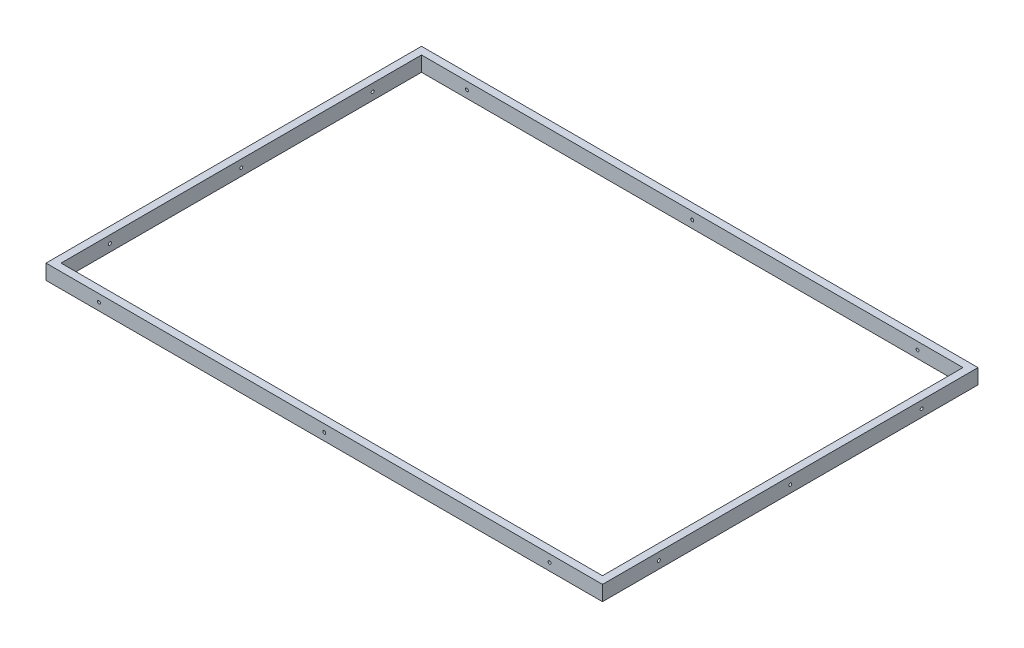
ISO-10303-21;
HEADER;
FILE_DESCRIPTION(('STEP AP214'),'2;1');
FILE_NAME('part.step','',(''),(''),'','','');
FILE_SCHEMA(('AUTOMOTIVE_DESIGN { 1 0 10303 214 1 1 1 1 }'));
ENDSEC;
DATA;
#1=APPLICATION_CONTEXT('core data for automotive mechanical design processes');
#2=APPLICATION_PROTOCOL_DEFINITION('international standard','automotive_design',2000,#1);
#3=PRODUCT_CONTEXT('',#1,'mechanical');
#4=PRODUCT('Part','Part','',(#3));
#5=PRODUCT_RELATED_PRODUCT_CATEGORY('part','',(#4));
#6=PRODUCT_DEFINITION_FORMATION('','',#4);
#7=PRODUCT_DEFINITION_CONTEXT('part definition',#1,'design');
#8=PRODUCT_DEFINITION('design','',#6,#7);
#9=PRODUCT_DEFINITION_SHAPE('','',#8);
#10=(LENGTH_UNIT() NAMED_UNIT(*) SI_UNIT(.MILLI.,.METRE.));
#11=(NAMED_UNIT(*) PLANE_ANGLE_UNIT() SI_UNIT($,.RADIAN.));
#12=(NAMED_UNIT(*) SI_UNIT($,.STERADIAN.) SOLID_ANGLE_UNIT());
#13=UNCERTAINTY_MEASURE_WITH_UNIT(LENGTH_MEASURE(1.E-05),#10,'distance_accuracy_value','');
#14=(GEOMETRIC_REPRESENTATION_CONTEXT(3) GLOBAL_UNCERTAINTY_ASSIGNED_CONTEXT((#13)) GLOBAL_UNIT_ASSIGNED_CONTEXT((#10,
#11,#12)) REPRESENTATION_CONTEXT('',''));
#15=CARTESIAN_POINT('',(0.,0.,0.));
#16=DIRECTION('',(0.,0.,1.));
#17=DIRECTION('',(1.,0.,0.));
#18=AXIS2_PLACEMENT_3D('',#15,#16,#17);
#19=CARTESIAN_POINT('',(0.,4.,0.));
#20=DIRECTION('',(0.,-1.,0.));
#21=DIRECTION('',(0.,0.,-1.));
#22=AXIS2_PLACEMENT_3D('',#19,#20,#21);
#23=PLANE('',#22);
#24=DIRECTION('',(0.,0.,-1.));
#25=VECTOR('',#24,1.);
#26=CARTESIAN_POINT('',(74.1,4.,50.));
#27=LINE('',#26,#25);
#28=CARTESIAN_POINT('',(74.1,4.,50.));
#29=VERTEX_POINT('',#28);
#30=CARTESIAN_POINT('',(74.1,4.,-50.));
#31=VERTEX_POINT('',#30);
#32=EDGE_CURVE('E144',#29,#31,#27,.T.);
#33=ORIENTED_EDGE('',*,*,#32,.T.);
#34=DIRECTION('',(-1.,0.,0.));
#35=VECTOR('',#34,1.);
#36=CARTESIAN_POINT('',(-74.1,4.,-50.));
#37=LINE('',#36,#35);
#38=CARTESIAN_POINT('',(-74.1,4.,-50.));
#39=VERTEX_POINT('',#38);
#40=EDGE_CURVE('E147',#31,#39,#37,.T.);
#41=ORIENTED_EDGE('',*,*,#40,.T.);
#42=DIRECTION('',(0.,0.,1.));
#43=VECTOR('',#42,1.);
#44=CARTESIAN_POINT('',(-74.1,4.,50.));
#45=LINE('',#44,#43);
#46=CARTESIAN_POINT('',(-74.1,4.,50.));
#47=VERTEX_POINT('',#46);
#48=EDGE_CURVE('E150',#39,#47,#45,.T.);
#49=ORIENTED_EDGE('',*,*,#48,.T.);
#50=DIRECTION('',(1.,0.,0.));
#51=VECTOR('',#50,1.);
#52=CARTESIAN_POINT('',(-74.1,4.,50.));
#53=LINE('',#52,#51);
#54=EDGE_CURVE('E152',#47,#29,#53,.T.);
#55=ORIENTED_EDGE('',*,*,#54,.T.);
#56=EDGE_LOOP('',(#33,#41,#49,#55));
#57=FACE_BOUND('',#56,.T.);
#58=DIRECTION('',(0.,0.,1.));
#59=VECTOR('',#58,1.);
#60=CARTESIAN_POINT('',(-72.1,4.,-48.));
#61=LINE('',#60,#59);
#62=CARTESIAN_POINT('',(-72.1,4.,-48.));
#63=VERTEX_POINT('',#62);
#64=CARTESIAN_POINT('',(-72.1,4.,48.));
#65=VERTEX_POINT('',#64);
#66=EDGE_CURVE('E106',#63,#65,#61,.T.);
#67=ORIENTED_EDGE('',*,*,#66,.F.);
#68=DIRECTION('',(-1.,0.,0.));
#69=VECTOR('',#68,1.);
#70=CARTESIAN_POINT('',(-72.1,4.,-48.));
#71=LINE('',#70,#69);
#72=CARTESIAN_POINT('',(72.1,4.,-48.));
#73=VERTEX_POINT('',#72);
#74=EDGE_CURVE('E128',#73,#63,#71,.T.);
#75=ORIENTED_EDGE('',*,*,#74,.F.);
#76=DIRECTION('',(0.,0.,-1.));
#77=VECTOR('',#76,1.);
#78=CARTESIAN_POINT('',(72.1,4.,-48.));
#79=LINE('',#78,#77);
#80=CARTESIAN_POINT('',(72.1,4.,48.));
#81=VERTEX_POINT('',#80);
#82=EDGE_CURVE('E126',#81,#73,#79,.T.);
#83=ORIENTED_EDGE('',*,*,#82,.F.);
#84=DIRECTION('',(1.,0.,0.));
#85=VECTOR('',#84,1.);
#86=CARTESIAN_POINT('',(-72.1,4.,48.));
#87=LINE('',#86,#85);
#88=EDGE_CURVE('E114',#65,#81,#87,.T.);
#89=ORIENTED_EDGE('',*,*,#88,.F.);
#90=EDGE_LOOP('',(#67,#75,#83,#89));
#91=FACE_BOUND('',#90,.T.);
#92=ADVANCED_FACE('F39',(#57,#91),#23,.F.);
#93=CARTESIAN_POINT('',(0.,0.,0.));
#94=DIRECTION('',(0.,-1.,0.));
#95=DIRECTION('',(0.,0.,-1.));
#96=AXIS2_PLACEMENT_3D('',#93,#94,#95);
#97=PLANE('',#96);
#98=DIRECTION('',(0.,0.,-1.));
#99=VECTOR('',#98,1.);
#100=CARTESIAN_POINT('',(74.1,0.,50.));
#101=LINE('',#100,#99);
#102=CARTESIAN_POINT('',(74.1,0.,50.));
#103=VERTEX_POINT('',#102);
#104=CARTESIAN_POINT('',(74.1,0.,-50.));
#105=VERTEX_POINT('',#104);
#106=EDGE_CURVE('E122',#103,#105,#101,.T.);
#107=ORIENTED_EDGE('',*,*,#106,.F.);
#108=DIRECTION('',(1.,0.,0.));
#109=VECTOR('',#108,1.);
#110=CARTESIAN_POINT('',(-74.1,0.,50.));
#111=LINE('',#110,#109);
#112=CARTESIAN_POINT('',(-74.1,0.,50.));
#113=VERTEX_POINT('',#112);
#114=EDGE_CURVE('E148',#113,#103,#111,.T.);
#115=ORIENTED_EDGE('',*,*,#114,.F.);
#116=DIRECTION('',(0.,0.,1.));
#117=VECTOR('',#116,1.);
#118=CARTESIAN_POINT('',(-74.1,0.,50.));
#119=LINE('',#118,#117);
#120=CARTESIAN_POINT('',(-74.1,0.,-50.));
#121=VERTEX_POINT('',#120);
#122=EDGE_CURVE('E159',#121,#113,#119,.T.);
#123=ORIENTED_EDGE('',*,*,#122,.F.);
#124=DIRECTION('',(-1.,0.,0.));
#125=VECTOR('',#124,1.);
#126=CARTESIAN_POINT('',(-74.1,0.,-50.));
#127=LINE('',#126,#125);
#128=EDGE_CURVE('E157',#105,#121,#127,.T.);
#129=ORIENTED_EDGE('',*,*,#128,.F.);
#130=EDGE_LOOP('',(#107,#115,#123,#129));
#131=FACE_BOUND('',#130,.T.);
#132=DIRECTION('',(-1.,0.,0.));
#133=VECTOR('',#132,1.);
#134=CARTESIAN_POINT('',(-72.1,0.,-48.));
#135=LINE('',#134,#133);
#136=CARTESIAN_POINT('',(72.1,0.,-48.));
#137=VERTEX_POINT('',#136);
#138=CARTESIAN_POINT('',(-72.1,0.,-48.));
#139=VERTEX_POINT('',#138);
#140=EDGE_CURVE('E115',#137,#139,#135,.T.);
#141=ORIENTED_EDGE('',*,*,#140,.T.);
#142=DIRECTION('',(0.,0.,1.));
#143=VECTOR('',#142,1.);
#144=CARTESIAN_POINT('',(-72.1,0.,-48.));
#145=LINE('',#144,#143);
#146=CARTESIAN_POINT('',(-72.1,0.,48.));
#147=VERTEX_POINT('',#146);
#148=EDGE_CURVE('E64',#139,#147,#145,.T.);
#149=ORIENTED_EDGE('',*,*,#148,.T.);
#150=DIRECTION('',(1.,0.,0.));
#151=VECTOR('',#150,1.);
#152=CARTESIAN_POINT('',(-72.1,0.,48.));
#153=LINE('',#152,#151);
#154=CARTESIAN_POINT('',(72.1,0.,48.));
#155=VERTEX_POINT('',#154);
#156=EDGE_CURVE('E121',#147,#155,#153,.T.);
#157=ORIENTED_EDGE('',*,*,#156,.T.);
#158=DIRECTION('',(0.,0.,-1.));
#159=VECTOR('',#158,1.);
#160=CARTESIAN_POINT('',(72.1,0.,-48.));
#161=LINE('',#160,#159);
#162=EDGE_CURVE('E136',#155,#137,#161,.T.);
#163=ORIENTED_EDGE('',*,*,#162,.T.);
#164=EDGE_LOOP('',(#141,#149,#157,#163));
#165=FACE_BOUND('',#164,.T.);
#166=ADVANCED_FACE('F262',(#131,#165),#97,.T.);
#167=CARTESIAN_POINT('',(74.1,4.,50.));
#168=DIRECTION('',(-1.,0.,0.));
#169=DIRECTION('',(0.,0.,1.));
#170=AXIS2_PLACEMENT_3D('',#167,#168,#169);
#171=PLANE('',#170);
#172=CARTESIAN_POINT('',(74.1,2.,-35.));
#173=DIRECTION('',(-1.,0.,0.));
#174=DIRECTION('',(0.,0.,1.));
#175=AXIS2_PLACEMENT_3D('',#172,#173,#174);
#176=CIRCLE('',#175,0.399999999999998);
#177=CARTESIAN_POINT('',(74.1,2.,-34.6));
#178=VERTEX_POINT('',#177);
#179=EDGE_CURVE('E342',#178,#178,#176,.T.);
#180=ORIENTED_EDGE('',*,*,#179,.T.);
#181=EDGE_LOOP('',(#180));
#182=FACE_BOUND('',#181,.T.);
#183=CARTESIAN_POINT('',(74.1,2.,35.));
#184=DIRECTION('',(-1.,0.,0.));
#185=DIRECTION('',(0.,0.,1.));
#186=AXIS2_PLACEMENT_3D('',#183,#184,#185);
#187=CIRCLE('',#186,0.399999999999998);
#188=CARTESIAN_POINT('',(74.1,2.,35.4));
#189=VERTEX_POINT('',#188);
#190=EDGE_CURVE('E333',#189,#189,#187,.T.);
#191=ORIENTED_EDGE('',*,*,#190,.T.);
#192=EDGE_LOOP('',(#191));
#193=FACE_BOUND('',#192,.T.);
#194=CARTESIAN_POINT('',(74.1,2.,0.));
#195=DIRECTION('',(-1.,0.,0.));
#196=DIRECTION('',(0.,0.,1.));
#197=AXIS2_PLACEMENT_3D('',#194,#195,#196);
#198=CIRCLE('',#197,0.4);
#199=CARTESIAN_POINT('',(74.1,2.,0.4));
#200=VERTEX_POINT('',#199);
#201=EDGE_CURVE('E184',#200,#200,#198,.T.);
#202=ORIENTED_EDGE('',*,*,#201,.T.);
#203=EDGE_LOOP('',(#202));
#204=FACE_BOUND('',#203,.T.);
#205=ORIENTED_EDGE('',*,*,#106,.T.);
#206=DIRECTION('',(0.,-1.,0.));
#207=VECTOR('',#206,1.);
#208=CARTESIAN_POINT('',(74.1,4.,-50.));
#209=LINE('',#208,#207);
#210=EDGE_CURVE('E11',#31,#105,#209,.T.);
#211=ORIENTED_EDGE('',*,*,#210,.F.);
#212=ORIENTED_EDGE('',*,*,#32,.F.);
#213=DIRECTION('',(0.,-1.,0.));
#214=VECTOR('',#213,1.);
#215=CARTESIAN_POINT('',(74.1,4.,50.));
#216=LINE('',#215,#214);
#217=EDGE_CURVE('E154',#29,#103,#216,.T.);
#218=ORIENTED_EDGE('',*,*,#217,.T.);
#219=EDGE_LOOP('',(#205,#211,#212,#218));
#220=FACE_BOUND('',#219,.T.);
#221=ADVANCED_FACE('F41',(#182,#193,#204,#220),#171,.F.);
#222=CARTESIAN_POINT('',(-74.1,4.,-50.));
#223=DIRECTION('',(0.,0.,1.));
#224=DIRECTION('',(1.,0.,0.));
#225=AXIS2_PLACEMENT_3D('',#222,#223,#224);
#226=PLANE('',#225);
#227=CARTESIAN_POINT('',(60.,2.,-50.));
#228=DIRECTION('',(0.,0.,1.));
#229=DIRECTION('',(1.,0.,0.));
#230=AXIS2_PLACEMENT_3D('',#227,#228,#229);
#231=CIRCLE('',#230,0.399999999999998);
#232=CARTESIAN_POINT('',(60.4,2.,-50.));
#233=VERTEX_POINT('',#232);
#234=EDGE_CURVE('E203',#233,#233,#231,.T.);
#235=ORIENTED_EDGE('',*,*,#234,.T.);
#236=EDGE_LOOP('',(#235));
#237=FACE_BOUND('',#236,.T.);
#238=CARTESIAN_POINT('',(-60.,2.,-50.));
#239=DIRECTION('',(0.,0.,1.));
#240=DIRECTION('',(1.,0.,0.));
#241=AXIS2_PLACEMENT_3D('',#238,#239,#240);
#242=CIRCLE('',#241,0.399999999999998);
#243=CARTESIAN_POINT('',(-59.6,2.,-50.));
#244=VERTEX_POINT('',#243);
#245=EDGE_CURVE('E208',#244,#244,#242,.T.);
#246=ORIENTED_EDGE('',*,*,#245,.T.);
#247=EDGE_LOOP('',(#246));
#248=FACE_BOUND('',#247,.T.);
#249=CARTESIAN_POINT('',(0.,2.,-50.));
#250=DIRECTION('',(0.,0.,1.));
#251=DIRECTION('',(1.,0.,0.));
#252=AXIS2_PLACEMENT_3D('',#249,#250,#251);
#253=CIRCLE('',#252,0.4);
#254=CARTESIAN_POINT('',(0.4,2.,-50.));
#255=VERTEX_POINT('',#254);
#256=EDGE_CURVE('E173',#255,#255,#253,.T.);
#257=ORIENTED_EDGE('',*,*,#256,.T.);
#258=EDGE_LOOP('',(#257));
#259=FACE_BOUND('',#258,.T.);
#260=ORIENTED_EDGE('',*,*,#128,.T.);
#261=DIRECTION('',(0.,-1.,0.));
#262=VECTOR('',#261,1.);
#263=CARTESIAN_POINT('',(-74.1,4.,-50.));
#264=LINE('',#263,#262);
#265=EDGE_CURVE('E48',#39,#121,#264,.T.);
#266=ORIENTED_EDGE('',*,*,#265,.F.);
#267=ORIENTED_EDGE('',*,*,#40,.F.);
#268=ORIENTED_EDGE('',*,*,#210,.T.);
#269=EDGE_LOOP('',(#260,#266,#267,#268));
#270=FACE_BOUND('',#269,.T.);
#271=ADVANCED_FACE('F266',(#237,#248,#259,#270),#226,.F.);
#272=CARTESIAN_POINT('',(-74.1,4.,50.));
#273=DIRECTION('',(1.,0.,0.));
#274=DIRECTION('',(0.,0.,-1.));
#275=AXIS2_PLACEMENT_3D('',#272,#273,#274);
#276=PLANE('',#275);
#277=CARTESIAN_POINT('',(-74.1,2.,-35.));
#278=DIRECTION('',(-1.,0.,0.));
#279=DIRECTION('',(0.,0.,1.));
#280=AXIS2_PLACEMENT_3D('',#277,#278,#279);
#281=CIRCLE('',#280,0.399999999999998);
#282=CARTESIAN_POINT('',(-74.1,2.,-34.6));
#283=VERTEX_POINT('',#282);
#284=EDGE_CURVE('E337',#283,#283,#281,.T.);
#285=ORIENTED_EDGE('',*,*,#284,.F.);
#286=EDGE_LOOP('',(#285));
#287=FACE_BOUND('',#286,.T.);
#288=CARTESIAN_POINT('',(-74.1,2.,35.));
#289=DIRECTION('',(-1.,0.,0.));
#290=DIRECTION('',(0.,0.,1.));
#291=AXIS2_PLACEMENT_3D('',#288,#289,#290);
#292=CIRCLE('',#291,0.399999999999998);
#293=CARTESIAN_POINT('',(-74.1,2.,35.4));
#294=VERTEX_POINT('',#293);
#295=EDGE_CURVE('E332',#294,#294,#292,.T.);
#296=ORIENTED_EDGE('',*,*,#295,.F.);
#297=EDGE_LOOP('',(#296));
#298=FACE_BOUND('',#297,.T.);
#299=CARTESIAN_POINT('',(-74.1,2.,0.));
#300=DIRECTION('',(-1.,0.,0.));
#301=DIRECTION('',(0.,0.,1.));
#302=AXIS2_PLACEMENT_3D('',#299,#300,#301);
#303=CIRCLE('',#302,0.4);
#304=CARTESIAN_POINT('',(-74.1,2.,0.4));
#305=VERTEX_POINT('',#304);
#306=EDGE_CURVE('E197',#305,#305,#303,.T.);
#307=ORIENTED_EDGE('',*,*,#306,.F.);
#308=EDGE_LOOP('',(#307));
#309=FACE_BOUND('',#308,.T.);
#310=ORIENTED_EDGE('',*,*,#122,.T.);
#311=DIRECTION('',(0.,-1.,0.));
#312=VECTOR('',#311,1.);
#313=CARTESIAN_POINT('',(-74.1,4.,50.));
#314=LINE('',#313,#312);
#315=EDGE_CURVE('E164',#47,#113,#314,.T.);
#316=ORIENTED_EDGE('',*,*,#315,.F.);
#317=ORIENTED_EDGE('',*,*,#48,.F.);
#318=ORIENTED_EDGE('',*,*,#265,.T.);
#319=EDGE_LOOP('',(#310,#316,#317,#318));
#320=FACE_BOUND('',#319,.T.);
#321=ADVANCED_FACE('F249',(#287,#298,#309,#320),#276,.F.);
#322=CARTESIAN_POINT('',(-74.1,4.,50.));
#323=DIRECTION('',(0.,0.,-1.));
#324=DIRECTION('',(-1.,0.,0.));
#325=AXIS2_PLACEMENT_3D('',#322,#323,#324);
#326=PLANE('',#325);
#327=CARTESIAN_POINT('',(60.,2.,50.));
#328=DIRECTION('',(0.,0.,1.));
#329=DIRECTION('',(1.,0.,0.));
#330=AXIS2_PLACEMENT_3D('',#327,#328,#329);
#331=CIRCLE('',#330,0.399999999999998);
#332=CARTESIAN_POINT('',(60.4,2.,50.));
#333=VERTEX_POINT('',#332);
#334=EDGE_CURVE('E211',#333,#333,#331,.T.);
#335=ORIENTED_EDGE('',*,*,#334,.F.);
#336=EDGE_LOOP('',(#335));
#337=FACE_BOUND('',#336,.T.);
#338=CARTESIAN_POINT('',(-60.,2.,50.));
#339=DIRECTION('',(0.,0.,1.));
#340=DIRECTION('',(1.,0.,0.));
#341=AXIS2_PLACEMENT_3D('',#338,#339,#340);
#342=CIRCLE('',#341,0.399999999999998);
#343=CARTESIAN_POINT('',(-59.6,2.,50.));
#344=VERTEX_POINT('',#343);
#345=EDGE_CURVE('E204',#344,#344,#342,.T.);
#346=ORIENTED_EDGE('',*,*,#345,.F.);
#347=EDGE_LOOP('',(#346));
#348=FACE_BOUND('',#347,.T.);
#349=CARTESIAN_POINT('',(0.,2.,50.));
#350=DIRECTION('',(0.,0.,1.));
#351=DIRECTION('',(1.,0.,0.));
#352=AXIS2_PLACEMENT_3D('',#349,#350,#351);
#353=CIRCLE('',#352,0.4);
#354=CARTESIAN_POINT('',(0.4,2.,50.));
#355=VERTEX_POINT('',#354);
#356=EDGE_CURVE('E207',#355,#355,#353,.T.);
#357=ORIENTED_EDGE('',*,*,#356,.F.);
#358=EDGE_LOOP('',(#357));
#359=FACE_BOUND('',#358,.T.);
#360=ORIENTED_EDGE('',*,*,#114,.T.);
#361=ORIENTED_EDGE('',*,*,#217,.F.);
#362=ORIENTED_EDGE('',*,*,#54,.F.);
#363=ORIENTED_EDGE('',*,*,#315,.T.);
#364=EDGE_LOOP('',(#360,#361,#362,#363));
#365=FACE_BOUND('',#364,.T.);
#366=ADVANCED_FACE('F246',(#337,#348,#359,#365),#326,.F.);
#367=CARTESIAN_POINT('',(-72.1,4.,-48.));
#368=DIRECTION('',(1.,0.,0.));
#369=DIRECTION('',(0.,0.,-1.));
#370=AXIS2_PLACEMENT_3D('',#367,#368,#369);
#371=PLANE('',#370);
#372=CARTESIAN_POINT('',(-72.1,2.,-35.));
#373=DIRECTION('',(1.,0.,0.));
#374=DIRECTION('',(0.,0.,-1.));
#375=AXIS2_PLACEMENT_3D('',#372,#373,#374);
#376=CIRCLE('',#375,0.399999999999998);
#377=CARTESIAN_POINT('',(-72.1,2.,-35.4));
#378=VERTEX_POINT('',#377);
#379=EDGE_CURVE('E200',#378,#378,#376,.T.);
#380=ORIENTED_EDGE('',*,*,#379,.F.);
#381=EDGE_LOOP('',(#380));
#382=FACE_BOUND('',#381,.T.);
#383=CARTESIAN_POINT('',(-72.1,2.,35.));
#384=DIRECTION('',(1.,0.,0.));
#385=DIRECTION('',(0.,0.,-1.));
#386=AXIS2_PLACEMENT_3D('',#383,#384,#385);
#387=CIRCLE('',#386,0.399999999999998);
#388=CARTESIAN_POINT('',(-72.1,2.,34.6));
#389=VERTEX_POINT('',#388);
#390=EDGE_CURVE('E187',#389,#389,#387,.T.);
#391=ORIENTED_EDGE('',*,*,#390,.F.);
#392=EDGE_LOOP('',(#391));
#393=FACE_BOUND('',#392,.T.);
#394=CARTESIAN_POINT('',(-72.1,2.,0.));
#395=DIRECTION('',(1.,0.,0.));
#396=DIRECTION('',(0.,0.,-1.));
#397=AXIS2_PLACEMENT_3D('',#394,#395,#396);
#398=CIRCLE('',#397,0.4);
#399=CARTESIAN_POINT('',(-72.1,2.,-0.4));
#400=VERTEX_POINT('',#399);
#401=EDGE_CURVE('E183',#400,#400,#398,.T.);
#402=ORIENTED_EDGE('',*,*,#401,.F.);
#403=EDGE_LOOP('',(#402));
#404=FACE_BOUND('',#403,.T.);
#405=ORIENTED_EDGE('',*,*,#148,.F.);
#406=DIRECTION('',(0.,-1.,0.));
#407=VECTOR('',#406,1.);
#408=CARTESIAN_POINT('',(-72.1,4.,-48.));
#409=LINE('',#408,#407);
#410=EDGE_CURVE('E110',#63,#139,#409,.T.);
#411=ORIENTED_EDGE('',*,*,#410,.F.);
#412=ORIENTED_EDGE('',*,*,#66,.T.);
#413=DIRECTION('',(0.,-1.,0.));
#414=VECTOR('',#413,1.);
#415=CARTESIAN_POINT('',(-72.1,4.,48.));
#416=LINE('',#415,#414);
#417=EDGE_CURVE('E109',#65,#147,#416,.T.);
#418=ORIENTED_EDGE('',*,*,#417,.T.);
#419=EDGE_LOOP('',(#405,#411,#412,#418));
#420=FACE_BOUND('',#419,.T.);
#421=ADVANCED_FACE('F108',(#382,#393,#404,#420),#371,.T.);
#422=CARTESIAN_POINT('',(-72.1,4.,48.));
#423=DIRECTION('',(0.,0.,-1.));
#424=DIRECTION('',(-1.,0.,0.));
#425=AXIS2_PLACEMENT_3D('',#422,#423,#424);
#426=PLANE('',#425);
#427=CARTESIAN_POINT('',(60.,2.,48.));
#428=DIRECTION('',(0.,0.,-1.));
#429=DIRECTION('',(-1.,0.,0.));
#430=AXIS2_PLACEMENT_3D('',#427,#428,#429);
#431=CIRCLE('',#430,0.399999999999998);
#432=CARTESIAN_POINT('',(59.6,2.,48.));
#433=VERTEX_POINT('',#432);
#434=EDGE_CURVE('E134',#433,#433,#431,.T.);
#435=ORIENTED_EDGE('',*,*,#434,.F.);
#436=EDGE_LOOP('',(#435));
#437=FACE_BOUND('',#436,.T.);
#438=CARTESIAN_POINT('',(-60.,2.,48.));
#439=DIRECTION('',(0.,0.,-1.));
#440=DIRECTION('',(-1.,0.,0.));
#441=AXIS2_PLACEMENT_3D('',#438,#439,#440);
#442=CIRCLE('',#441,0.399999999999998);
#443=CARTESIAN_POINT('',(-60.4,2.,48.));
#444=VERTEX_POINT('',#443);
#445=EDGE_CURVE('E177',#444,#444,#442,.T.);
#446=ORIENTED_EDGE('',*,*,#445,.F.);
#447=EDGE_LOOP('',(#446));
#448=FACE_BOUND('',#447,.T.);
#449=CARTESIAN_POINT('',(0.,2.,48.));
#450=DIRECTION('',(0.,0.,-1.));
#451=DIRECTION('',(-1.,0.,0.));
#452=AXIS2_PLACEMENT_3D('',#449,#450,#451);
#453=CIRCLE('',#452,0.4);
#454=CARTESIAN_POINT('',(-0.4,2.,48.));
#455=VERTEX_POINT('',#454);
#456=EDGE_CURVE('E172',#455,#455,#453,.T.);
#457=ORIENTED_EDGE('',*,*,#456,.F.);
#458=EDGE_LOOP('',(#457));
#459=FACE_BOUND('',#458,.T.);
#460=ORIENTED_EDGE('',*,*,#156,.F.);
#461=ORIENTED_EDGE('',*,*,#417,.F.);
#462=ORIENTED_EDGE('',*,*,#88,.T.);
#463=DIRECTION('',(0.,-1.,0.));
#464=VECTOR('',#463,1.);
#465=CARTESIAN_POINT('',(72.1,4.,48.));
#466=LINE('',#465,#464);
#467=EDGE_CURVE('E123',#81,#155,#466,.T.);
#468=ORIENTED_EDGE('',*,*,#467,.T.);
#469=EDGE_LOOP('',(#460,#461,#462,#468));
#470=FACE_BOUND('',#469,.T.);
#471=ADVANCED_FACE('F118',(#437,#448,#459,#470),#426,.T.);
#472=CARTESIAN_POINT('',(72.1,4.,-48.));
#473=DIRECTION('',(-1.,0.,0.));
#474=DIRECTION('',(0.,0.,1.));
#475=AXIS2_PLACEMENT_3D('',#472,#473,#474);
#476=PLANE('',#475);
#477=CARTESIAN_POINT('',(72.1,2.,-35.));
#478=DIRECTION('',(-1.,0.,0.));
#479=DIRECTION('',(0.,0.,1.));
#480=AXIS2_PLACEMENT_3D('',#477,#478,#479);
#481=CIRCLE('',#480,0.399999999999998);
#482=CARTESIAN_POINT('',(72.1,2.,-34.6));
#483=VERTEX_POINT('',#482);
#484=EDGE_CURVE('E43',#483,#483,#481,.T.);
#485=ORIENTED_EDGE('',*,*,#484,.F.);
#486=EDGE_LOOP('',(#485));
#487=FACE_BOUND('',#486,.T.);
#488=CARTESIAN_POINT('',(72.1,2.,35.));
#489=DIRECTION('',(-1.,0.,0.));
#490=DIRECTION('',(0.,0.,1.));
#491=AXIS2_PLACEMENT_3D('',#488,#489,#490);
#492=CIRCLE('',#491,0.399999999999998);
#493=CARTESIAN_POINT('',(72.1,2.,35.4));
#494=VERTEX_POINT('',#493);
#495=EDGE_CURVE('E185',#494,#494,#492,.T.);
#496=ORIENTED_EDGE('',*,*,#495,.F.);
#497=EDGE_LOOP('',(#496));
#498=FACE_BOUND('',#497,.T.);
#499=CARTESIAN_POINT('',(72.1,2.,0.));
#500=DIRECTION('',(-1.,0.,0.));
#501=DIRECTION('',(0.,0.,1.));
#502=AXIS2_PLACEMENT_3D('',#499,#500,#501);
#503=CIRCLE('',#502,0.4);
#504=CARTESIAN_POINT('',(72.1,2.,0.4));
#505=VERTEX_POINT('',#504);
#506=EDGE_CURVE('E181',#505,#505,#503,.T.);
#507=ORIENTED_EDGE('',*,*,#506,.F.);
#508=EDGE_LOOP('',(#507));
#509=FACE_BOUND('',#508,.T.);
#510=ORIENTED_EDGE('',*,*,#162,.F.);
#511=ORIENTED_EDGE('',*,*,#467,.F.);
#512=ORIENTED_EDGE('',*,*,#82,.T.);
#513=DIRECTION('',(0.,-1.,0.));
#514=VECTOR('',#513,1.);
#515=CARTESIAN_POINT('',(72.1,4.,-48.));
#516=LINE('',#515,#514);
#517=EDGE_CURVE('E56',#73,#137,#516,.T.);
#518=ORIENTED_EDGE('',*,*,#517,.T.);
#519=EDGE_LOOP('',(#510,#511,#512,#518));
#520=FACE_BOUND('',#519,.T.);
#521=ADVANCED_FACE('F231',(#487,#498,#509,#520),#476,.T.);
#522=CARTESIAN_POINT('',(-72.1,4.,-48.));
#523=DIRECTION('',(0.,0.,1.));
#524=DIRECTION('',(1.,0.,0.));
#525=AXIS2_PLACEMENT_3D('',#522,#523,#524);
#526=PLANE('',#525);
#527=CARTESIAN_POINT('',(60.,2.,-48.));
#528=DIRECTION('',(0.,0.,1.));
#529=DIRECTION('',(1.,0.,0.));
#530=AXIS2_PLACEMENT_3D('',#527,#528,#529);
#531=CIRCLE('',#530,0.399999999999998);
#532=CARTESIAN_POINT('',(60.4,2.,-48.));
#533=VERTEX_POINT('',#532);
#534=EDGE_CURVE('E178',#533,#533,#531,.T.);
#535=ORIENTED_EDGE('',*,*,#534,.F.);
#536=EDGE_LOOP('',(#535));
#537=FACE_BOUND('',#536,.T.);
#538=CARTESIAN_POINT('',(-60.,2.,-48.));
#539=DIRECTION('',(0.,0.,1.));
#540=DIRECTION('',(1.,0.,0.));
#541=AXIS2_PLACEMENT_3D('',#538,#539,#540);
#542=CIRCLE('',#541,0.399999999999998);
#543=CARTESIAN_POINT('',(-59.6,2.,-48.));
#544=VERTEX_POINT('',#543);
#545=EDGE_CURVE('E174',#544,#544,#542,.T.);
#546=ORIENTED_EDGE('',*,*,#545,.F.);
#547=EDGE_LOOP('',(#546));
#548=FACE_BOUND('',#547,.T.);
#549=CARTESIAN_POINT('',(0.,2.,-48.));
#550=DIRECTION('',(0.,0.,1.));
#551=DIRECTION('',(1.,0.,0.));
#552=AXIS2_PLACEMENT_3D('',#549,#550,#551);
#553=CIRCLE('',#552,0.4);
#554=CARTESIAN_POINT('',(0.4,2.,-48.));
#555=VERTEX_POINT('',#554);
#556=EDGE_CURVE('E169',#555,#555,#553,.T.);
#557=ORIENTED_EDGE('',*,*,#556,.F.);
#558=EDGE_LOOP('',(#557));
#559=FACE_BOUND('',#558,.T.);
#560=ORIENTED_EDGE('',*,*,#140,.F.);
#561=ORIENTED_EDGE('',*,*,#517,.F.);
#562=ORIENTED_EDGE('',*,*,#74,.T.);
#563=ORIENTED_EDGE('',*,*,#410,.T.);
#564=EDGE_LOOP('',(#560,#561,#562,#563));
#565=FACE_BOUND('',#564,.T.);
#566=ADVANCED_FACE('F291',(#537,#548,#559,#565),#526,.T.);
#567=CARTESIAN_POINT('',(0.,2.,-50.));
#568=DIRECTION('',(0.,0.,1.));
#569=DIRECTION('',(1.,0.,0.));
#570=AXIS2_PLACEMENT_3D('',#567,#568,#569);
#571=CYLINDRICAL_SURFACE('',#570,0.4);
#572=ORIENTED_EDGE('',*,*,#556,.T.);
#573=EDGE_LOOP('',(#572));
#574=FACE_BOUND('',#573,.T.);
#575=ORIENTED_EDGE('',*,*,#256,.F.);
#576=EDGE_LOOP('',(#575));
#577=FACE_BOUND('',#576,.T.);
#578=ADVANCED_FACE('F243',(#574,#577),#571,.F.);
#579=CARTESIAN_POINT('',(-60.,2.,-50.));
#580=DIRECTION('',(0.,0.,1.));
#581=DIRECTION('',(1.,0.,0.));
#582=AXIS2_PLACEMENT_3D('',#579,#580,#581);
#583=CYLINDRICAL_SURFACE('',#582,0.399999999999998);
#584=ORIENTED_EDGE('',*,*,#545,.T.);
#585=EDGE_LOOP('',(#584));
#586=FACE_BOUND('',#585,.T.);
#587=ORIENTED_EDGE('',*,*,#245,.F.);
#588=EDGE_LOOP('',(#587));
#589=FACE_BOUND('',#588,.T.);
#590=ADVANCED_FACE('F297',(#586,#589),#583,.F.);
#591=CARTESIAN_POINT('',(60.,2.,-50.));
#592=DIRECTION('',(0.,0.,1.));
#593=DIRECTION('',(1.,0.,0.));
#594=AXIS2_PLACEMENT_3D('',#591,#592,#593);
#595=CYLINDRICAL_SURFACE('',#594,0.399999999999998);
#596=ORIENTED_EDGE('',*,*,#534,.T.);
#597=EDGE_LOOP('',(#596));
#598=FACE_BOUND('',#597,.T.);
#599=ORIENTED_EDGE('',*,*,#234,.F.);
#600=EDGE_LOOP('',(#599));
#601=FACE_BOUND('',#600,.T.);
#602=ADVANCED_FACE('F241',(#598,#601),#595,.F.);
#603=ORIENTED_EDGE('',*,*,#456,.T.);
#604=EDGE_LOOP('',(#603));
#605=FACE_BOUND('',#604,.T.);
#606=ORIENTED_EDGE('',*,*,#356,.T.);
#607=EDGE_LOOP('',(#606));
#608=FACE_BOUND('',#607,.T.);
#609=ADVANCED_FACE('F237',(#605,#608),#571,.F.);
#610=ORIENTED_EDGE('',*,*,#445,.T.);
#611=EDGE_LOOP('',(#610));
#612=FACE_BOUND('',#611,.T.);
#613=ORIENTED_EDGE('',*,*,#345,.T.);
#614=EDGE_LOOP('',(#613));
#615=FACE_BOUND('',#614,.T.);
#616=ADVANCED_FACE('F240',(#612,#615),#583,.F.);
#617=ORIENTED_EDGE('',*,*,#434,.T.);
#618=EDGE_LOOP('',(#617));
#619=FACE_BOUND('',#618,.T.);
#620=ORIENTED_EDGE('',*,*,#334,.T.);
#621=EDGE_LOOP('',(#620));
#622=FACE_BOUND('',#621,.T.);
#623=ADVANCED_FACE('F226',(#619,#622),#595,.F.);
#624=CARTESIAN_POINT('',(74.1,2.,0.));
#625=DIRECTION('',(-1.,0.,0.));
#626=DIRECTION('',(0.,0.,1.));
#627=AXIS2_PLACEMENT_3D('',#624,#625,#626);
#628=CYLINDRICAL_SURFACE('',#627,0.4);
#629=ORIENTED_EDGE('',*,*,#506,.T.);
#630=EDGE_LOOP('',(#629));
#631=FACE_BOUND('',#630,.T.);
#632=ORIENTED_EDGE('',*,*,#201,.F.);
#633=EDGE_LOOP('',(#632));
#634=FACE_BOUND('',#633,.T.);
#635=ADVANCED_FACE('F305',(#631,#634),#628,.F.);
#636=CARTESIAN_POINT('',(74.1,2.,35.));
#637=DIRECTION('',(-1.,0.,0.));
#638=DIRECTION('',(0.,0.,1.));
#639=AXIS2_PLACEMENT_3D('',#636,#637,#638);
#640=CYLINDRICAL_SURFACE('',#639,0.399999999999998);
#641=ORIENTED_EDGE('',*,*,#495,.T.);
#642=EDGE_LOOP('',(#641));
#643=FACE_BOUND('',#642,.T.);
#644=ORIENTED_EDGE('',*,*,#190,.F.);
#645=EDGE_LOOP('',(#644));
#646=FACE_BOUND('',#645,.T.);
#647=ADVANCED_FACE('F308',(#643,#646),#640,.F.);
#648=CARTESIAN_POINT('',(74.1,2.,-35.));
#649=DIRECTION('',(-1.,0.,0.));
#650=DIRECTION('',(0.,0.,1.));
#651=AXIS2_PLACEMENT_3D('',#648,#649,#650);
#652=CYLINDRICAL_SURFACE('',#651,0.399999999999998);
#653=ORIENTED_EDGE('',*,*,#484,.T.);
#654=EDGE_LOOP('',(#653));
#655=FACE_BOUND('',#654,.T.);
#656=ORIENTED_EDGE('',*,*,#179,.F.);
#657=EDGE_LOOP('',(#656));
#658=FACE_BOUND('',#657,.T.);
#659=ADVANCED_FACE('F311',(#655,#658),#652,.F.);
#660=ORIENTED_EDGE('',*,*,#401,.T.);
#661=EDGE_LOOP('',(#660));
#662=FACE_BOUND('',#661,.T.);
#663=ORIENTED_EDGE('',*,*,#306,.T.);
#664=EDGE_LOOP('',(#663));
#665=FACE_BOUND('',#664,.T.);
#666=ADVANCED_FACE('F310',(#662,#665),#628,.F.);
#667=ORIENTED_EDGE('',*,*,#390,.T.);
#668=EDGE_LOOP('',(#667));
#669=FACE_BOUND('',#668,.T.);
#670=ORIENTED_EDGE('',*,*,#295,.T.);
#671=EDGE_LOOP('',(#670));
#672=FACE_BOUND('',#671,.T.);
#673=ADVANCED_FACE('F317',(#669,#672),#640,.F.);
#674=ORIENTED_EDGE('',*,*,#379,.T.);
#675=EDGE_LOOP('',(#674));
#676=FACE_BOUND('',#675,.T.);
#677=ORIENTED_EDGE('',*,*,#284,.T.);
#678=EDGE_LOOP('',(#677));
#679=FACE_BOUND('',#678,.T.);
#680=ADVANCED_FACE('F315',(#676,#679),#652,.F.);
#681=CLOSED_SHELL('',(#92,#166,#221,#271,#321,#366,#421,#471,#521,#566,#578,#590,#602,#609,#616,
#623,#635,#647,#659,#666,#673,#680));
#682=MANIFOLD_SOLID_BREP('B2',#681);
#683=ADVANCED_BREP_SHAPE_REPRESENTATION('',(#18,#682),#14);
#684=SHAPE_DEFINITION_REPRESENTATION(#9,#683);
ENDSEC;
END-ISO-10303-21;
